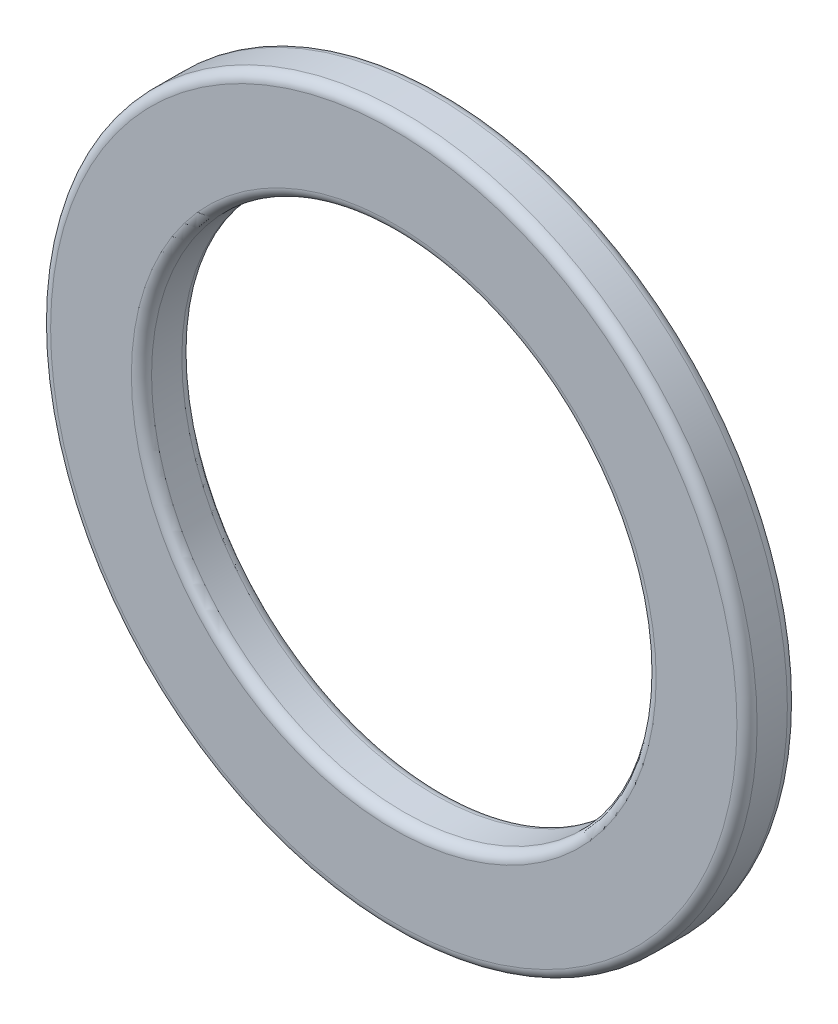
ISO-10303-21;
HEADER;
FILE_DESCRIPTION(('STEP AP214'),'2;1');
FILE_NAME('part.step','',(''),(''),'','','');
FILE_SCHEMA(('AUTOMOTIVE_DESIGN { 1 0 10303 214 1 1 1 1 }'));
ENDSEC;
DATA;
#1=APPLICATION_CONTEXT('core data for automotive mechanical design processes');
#2=APPLICATION_PROTOCOL_DEFINITION('international standard','automotive_design',2000,#1);
#3=PRODUCT_CONTEXT('',#1,'mechanical');
#4=PRODUCT('Part','Part','',(#3));
#5=PRODUCT_RELATED_PRODUCT_CATEGORY('part','',(#4));
#6=PRODUCT_DEFINITION_FORMATION('','',#4);
#7=PRODUCT_DEFINITION_CONTEXT('part definition',#1,'design');
#8=PRODUCT_DEFINITION('design','',#6,#7);
#9=PRODUCT_DEFINITION_SHAPE('','',#8);
#10=(LENGTH_UNIT() NAMED_UNIT(*) SI_UNIT(.MILLI.,.METRE.));
#11=(NAMED_UNIT(*) PLANE_ANGLE_UNIT() SI_UNIT($,.RADIAN.));
#12=(NAMED_UNIT(*) SI_UNIT($,.STERADIAN.) SOLID_ANGLE_UNIT());
#13=UNCERTAINTY_MEASURE_WITH_UNIT(LENGTH_MEASURE(1.E-05),#10,'distance_accuracy_value','');
#14=(GEOMETRIC_REPRESENTATION_CONTEXT(3) GLOBAL_UNCERTAINTY_ASSIGNED_CONTEXT((#13)) GLOBAL_UNIT_ASSIGNED_CONTEXT((#10,
#11,#12)) REPRESENTATION_CONTEXT('',''));
#15=CARTESIAN_POINT('',(0.,0.,0.));
#16=DIRECTION('',(0.,0.,1.));
#17=DIRECTION('',(1.,0.,0.));
#18=AXIS2_PLACEMENT_3D('',#15,#16,#17);
#19=CARTESIAN_POINT('',(0.,0.,-0.5));
#20=DIRECTION('',(0.,0.,1.));
#21=DIRECTION('',(1.,0.,0.));
#22=AXIS2_PLACEMENT_3D('',#19,#20,#21);
#23=PLANE('',#22);
#24=CARTESIAN_POINT('',(0.,0.,-0.5));
#25=DIRECTION('',(0.,0.,-1.));
#26=DIRECTION('',(1.,0.,0.));
#27=AXIS2_PLACEMENT_3D('',#24,#25,#26);
#28=CIRCLE('',#27,2.6);
#29=CARTESIAN_POINT('',(2.6,0.,-0.5));
#30=VERTEX_POINT('',#29);
#31=EDGE_CURVE('E86',#30,#30,#28,.T.);
#32=ORIENTED_EDGE('',*,*,#31,.F.);
#33=EDGE_LOOP('',(#32));
#34=FACE_BOUND('',#33,.T.);
#35=CARTESIAN_POINT('',(0.,0.,-0.5));
#36=DIRECTION('',(0.,0.,1.));
#37=DIRECTION('',(-1.,0.,0.));
#38=AXIS2_PLACEMENT_3D('',#35,#36,#37);
#39=CIRCLE('',#38,3.4);
#40=CARTESIAN_POINT('',(-3.4,0.,-0.5));
#41=VERTEX_POINT('',#40);
#42=EDGE_CURVE('E113',#41,#41,#39,.T.);
#43=ORIENTED_EDGE('',*,*,#42,.F.);
#44=EDGE_LOOP('',(#43));
#45=FACE_BOUND('',#44,.T.);
#46=ADVANCED_FACE('F15',(#34,#45),#23,.F.);
#47=CARTESIAN_POINT('',(0.,0.,-0.4));
#48=DIRECTION('',(0.,0.,-1.));
#49=DIRECTION('',(1.,0.,0.));
#50=AXIS2_PLACEMENT_3D('',#47,#48,#49);
#51=TOROIDAL_SURFACE('',#50,3.4,0.1);
#52=CARTESIAN_POINT('',(0.,0.,-0.4));
#53=DIRECTION('',(0.,0.,1.));
#54=DIRECTION('',(1.,0.,0.));
#55=AXIS2_PLACEMENT_3D('',#52,#53,#54);
#56=CIRCLE('',#55,3.5);
#57=CARTESIAN_POINT('',(3.5,0.,-0.4));
#58=VERTEX_POINT('',#57);
#59=EDGE_CURVE('E83',#58,#58,#56,.T.);
#60=ORIENTED_EDGE('',*,*,#59,.F.);
#61=EDGE_LOOP('',(#60));
#62=FACE_BOUND('',#61,.T.);
#63=ORIENTED_EDGE('',*,*,#42,.T.);
#64=EDGE_LOOP('',(#63));
#65=FACE_BOUND('',#64,.T.);
#66=ADVANCED_FACE('F96',(#62,#65),#51,.T.);
#67=CARTESIAN_POINT('',(0.,0.,-0.4));
#68=DIRECTION('',(0.,0.,1.));
#69=DIRECTION('',(-1.,0.,0.));
#70=AXIS2_PLACEMENT_3D('',#67,#68,#69);
#71=TOROIDAL_SURFACE('',#70,2.6,0.1);
#72=CARTESIAN_POINT('',(0.,0.,-0.4));
#73=DIRECTION('',(0.,0.,1.));
#74=DIRECTION('',(1.,0.,0.));
#75=AXIS2_PLACEMENT_3D('',#72,#73,#74);
#76=CIRCLE('',#75,2.5);
#77=CARTESIAN_POINT('',(2.5,0.,-0.4));
#78=VERTEX_POINT('',#77);
#79=EDGE_CURVE('E39',#78,#78,#76,.T.);
#80=ORIENTED_EDGE('',*,*,#79,.T.);
#81=EDGE_LOOP('',(#80));
#82=FACE_BOUND('',#81,.T.);
#83=ORIENTED_EDGE('',*,*,#31,.T.);
#84=EDGE_LOOP('',(#83));
#85=FACE_BOUND('',#84,.T.);
#86=ADVANCED_FACE('F92',(#82,#85),#71,.T.);
#87=CARTESIAN_POINT('',(0.,0.,0.));
#88=DIRECTION('',(0.,0.,1.));
#89=DIRECTION('',(1.,0.,0.));
#90=AXIS2_PLACEMENT_3D('',#87,#88,#89);
#91=CYLINDRICAL_SURFACE('',#90,3.5);
#92=CARTESIAN_POINT('',(0.,0.,-0.1));
#93=DIRECTION('',(0.,0.,-1.));
#94=DIRECTION('',(1.,0.,0.));
#95=AXIS2_PLACEMENT_3D('',#92,#93,#94);
#96=CIRCLE('',#95,3.5);
#97=CARTESIAN_POINT('',(3.5,0.,-0.1));
#98=VERTEX_POINT('',#97);
#99=EDGE_CURVE('E34',#98,#98,#96,.F.);
#100=ORIENTED_EDGE('',*,*,#99,.F.);
#101=EDGE_LOOP('',(#100));
#102=FACE_BOUND('',#101,.T.);
#103=ORIENTED_EDGE('',*,*,#59,.T.);
#104=EDGE_LOOP('',(#103));
#105=FACE_BOUND('',#104,.T.);
#106=ADVANCED_FACE('F95',(#102,#105),#91,.T.);
#107=CARTESIAN_POINT('',(0.,0.,0.));
#108=DIRECTION('',(0.,0.,1.));
#109=DIRECTION('',(1.,0.,0.));
#110=AXIS2_PLACEMENT_3D('',#107,#108,#109);
#111=CYLINDRICAL_SURFACE('',#110,2.5);
#112=CARTESIAN_POINT('',(0.,0.,-0.1));
#113=DIRECTION('',(0.,0.,1.));
#114=DIRECTION('',(-1.,0.,0.));
#115=AXIS2_PLACEMENT_3D('',#112,#113,#114);
#116=CIRCLE('',#115,2.5);
#117=CARTESIAN_POINT('',(-2.5,0.,-0.1));
#118=VERTEX_POINT('',#117);
#119=EDGE_CURVE('E29',#118,#118,#116,.F.);
#120=ORIENTED_EDGE('',*,*,#119,.F.);
#121=EDGE_LOOP('',(#120));
#122=FACE_BOUND('',#121,.T.);
#123=ORIENTED_EDGE('',*,*,#79,.F.);
#124=EDGE_LOOP('',(#123));
#125=FACE_BOUND('',#124,.T.);
#126=ADVANCED_FACE('F68',(#122,#125),#111,.F.);
#127=CARTESIAN_POINT('',(0.,0.,-0.1));
#128=DIRECTION('',(0.,0.,-1.));
#129=DIRECTION('',(1.,0.,0.));
#130=AXIS2_PLACEMENT_3D('',#127,#128,#129);
#131=TOROIDAL_SURFACE('',#130,3.4,0.1);
#132=CARTESIAN_POINT('',(0.,0.,0.));
#133=DIRECTION('',(0.,0.,-1.));
#134=DIRECTION('',(-1.,0.,0.));
#135=AXIS2_PLACEMENT_3D('',#132,#133,#134);
#136=CIRCLE('',#135,3.4);
#137=CARTESIAN_POINT('',(-3.4,0.,0.));
#138=VERTEX_POINT('',#137);
#139=EDGE_CURVE('E24',#138,#138,#136,.F.);
#140=ORIENTED_EDGE('',*,*,#139,.F.);
#141=EDGE_LOOP('',(#140));
#142=FACE_BOUND('',#141,.T.);
#143=ORIENTED_EDGE('',*,*,#99,.T.);
#144=EDGE_LOOP('',(#143));
#145=FACE_BOUND('',#144,.T.);
#146=ADVANCED_FACE('F63',(#142,#145),#131,.T.);
#147=CARTESIAN_POINT('',(0.,0.,-0.1));
#148=DIRECTION('',(0.,0.,1.));
#149=DIRECTION('',(-1.,0.,0.));
#150=AXIS2_PLACEMENT_3D('',#147,#148,#149);
#151=TOROIDAL_SURFACE('',#150,2.6,0.1);
#152=CARTESIAN_POINT('',(0.,0.,0.));
#153=DIRECTION('',(0.,0.,1.));
#154=DIRECTION('',(1.,0.,0.));
#155=AXIS2_PLACEMENT_3D('',#152,#153,#154);
#156=CIRCLE('',#155,2.6);
#157=CARTESIAN_POINT('',(2.6,0.,0.));
#158=VERTEX_POINT('',#157);
#159=EDGE_CURVE('E10',#158,#158,#156,.F.);
#160=ORIENTED_EDGE('',*,*,#159,.F.);
#161=EDGE_LOOP('',(#160));
#162=FACE_BOUND('',#161,.T.);
#163=ORIENTED_EDGE('',*,*,#119,.T.);
#164=EDGE_LOOP('',(#163));
#165=FACE_BOUND('',#164,.T.);
#166=ADVANCED_FACE('F52',(#162,#165),#151,.T.);
#167=CARTESIAN_POINT('',(0.,0.,0.));
#168=DIRECTION('',(0.,0.,1.));
#169=DIRECTION('',(1.,0.,0.));
#170=AXIS2_PLACEMENT_3D('',#167,#168,#169);
#171=PLANE('',#170);
#172=ORIENTED_EDGE('',*,*,#159,.T.);
#173=EDGE_LOOP('',(#172));
#174=FACE_BOUND('',#173,.T.);
#175=ORIENTED_EDGE('',*,*,#139,.T.);
#176=EDGE_LOOP('',(#175));
#177=FACE_BOUND('',#176,.T.);
#178=ADVANCED_FACE('F62',(#174,#177),#171,.T.);
#179=CLOSED_SHELL('',(#46,#66,#86,#106,#126,#146,#166,#178));
#180=MANIFOLD_SOLID_BREP('B1',#179);
#181=ADVANCED_BREP_SHAPE_REPRESENTATION('',(#18,#180),#14);
#182=SHAPE_DEFINITION_REPRESENTATION(#9,#181);
ENDSEC;
END-ISO-10303-21;
